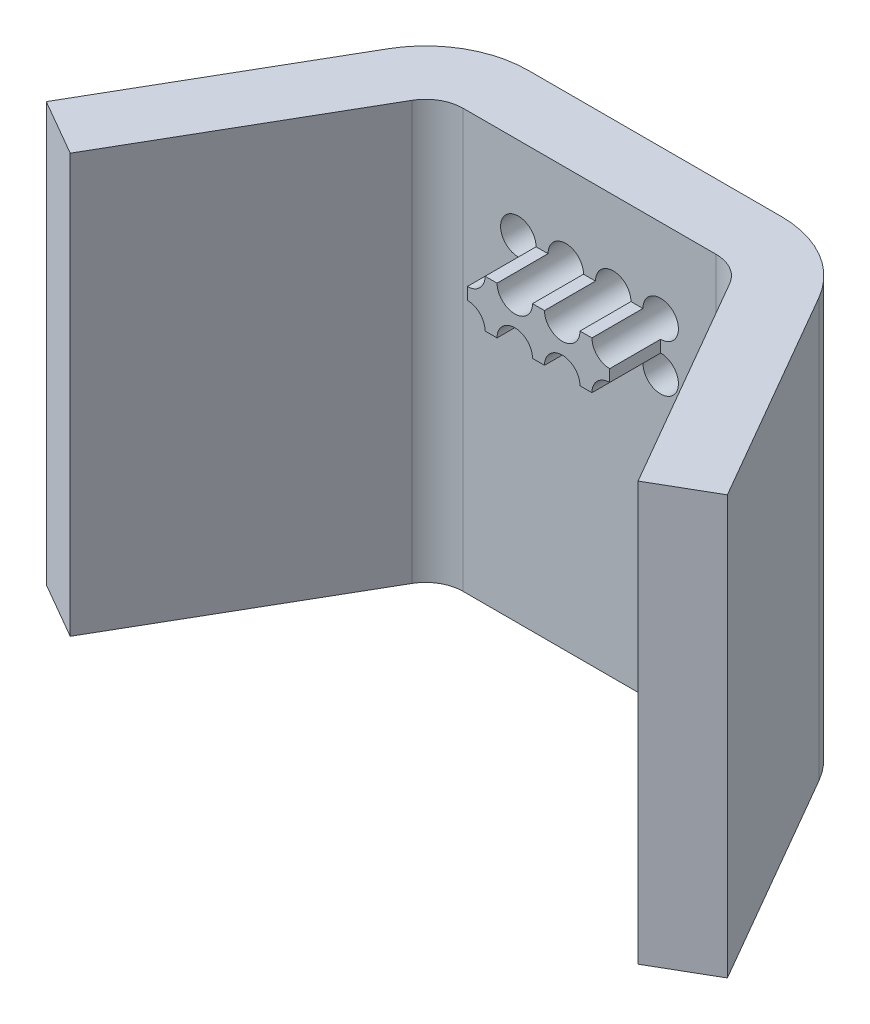
ISO-10303-21;
HEADER;
FILE_DESCRIPTION(('STEP AP214'),'2;1');
FILE_NAME('part.step','',(''),(''),'','','');
FILE_SCHEMA(('AUTOMOTIVE_DESIGN { 1 0 10303 214 1 1 1 1 }'));
ENDSEC;
DATA;
#1=APPLICATION_CONTEXT('core data for automotive mechanical design processes');
#2=APPLICATION_PROTOCOL_DEFINITION('international standard','automotive_design',2000,#1);
#3=PRODUCT_CONTEXT('',#1,'mechanical');
#4=PRODUCT('Part','Part','',(#3));
#5=PRODUCT_RELATED_PRODUCT_CATEGORY('part','',(#4));
#6=PRODUCT_DEFINITION_FORMATION('','',#4);
#7=PRODUCT_DEFINITION_CONTEXT('part definition',#1,'design');
#8=PRODUCT_DEFINITION('design','',#6,#7);
#9=PRODUCT_DEFINITION_SHAPE('','',#8);
#10=(LENGTH_UNIT() NAMED_UNIT(*) SI_UNIT(.MILLI.,.METRE.));
#11=(NAMED_UNIT(*) PLANE_ANGLE_UNIT() SI_UNIT($,.RADIAN.));
#12=(NAMED_UNIT(*) SI_UNIT($,.STERADIAN.) SOLID_ANGLE_UNIT());
#13=UNCERTAINTY_MEASURE_WITH_UNIT(LENGTH_MEASURE(1.E-05),#10,'distance_accuracy_value','');
#14=(GEOMETRIC_REPRESENTATION_CONTEXT(3) GLOBAL_UNCERTAINTY_ASSIGNED_CONTEXT((#13)) GLOBAL_UNIT_ASSIGNED_CONTEXT((#10,
#11,#12)) REPRESENTATION_CONTEXT('',''));
#15=CARTESIAN_POINT('',(0.,0.,0.));
#16=DIRECTION('',(0.,0.,1.));
#17=DIRECTION('',(1.,0.,0.));
#18=AXIS2_PLACEMENT_3D('',#15,#16,#17);
#19=CARTESIAN_POINT('',(-7.92538660821063,22.4,-7.92538660821063));
#20=DIRECTION('',(0.,0.,-1.));
#21=DIRECTION('',(-1.,0.,0.));
#22=AXIS2_PLACEMENT_3D('',#19,#20,#21);
#23=PLANE('',#22);
#24=DIRECTION('',(1.,0.,0.));
#25=VECTOR('',#24,1.);
#26=CARTESIAN_POINT('',(-7.92538660821063,0.,-7.92538660821063));
#27=LINE('',#26,#25);
#28=CARTESIAN_POINT('',(-6.77068606983139,0.,-7.92538660821063));
#29=VERTEX_POINT('',#28);
#30=CARTESIAN_POINT('',(6.77068606983138,0.,-7.92538660821063));
#31=VERTEX_POINT('',#30);
#32=EDGE_CURVE('E265',#29,#31,#27,.T.);
#33=ORIENTED_EDGE('',*,*,#32,.T.);
#34=DIRECTION('',(0.,-1.,0.));
#35=VECTOR('',#34,1.);
#36=CARTESIAN_POINT('',(6.77068606983138,22.4,-7.92538660821063));
#37=LINE('',#36,#35);
#38=CARTESIAN_POINT('',(6.77068606983138,22.4,-7.92538660821063));
#39=VERTEX_POINT('',#38);
#40=EDGE_CURVE('E337',#31,#39,#37,.F.);
#41=ORIENTED_EDGE('',*,*,#40,.T.);
#42=DIRECTION('',(1.,0.,0.));
#43=VECTOR('',#42,1.);
#44=CARTESIAN_POINT('',(-7.92538660821063,22.4,-7.92538660821063));
#45=LINE('',#44,#43);
#46=CARTESIAN_POINT('',(-6.77068606983139,22.4,-7.92538660821063));
#47=VERTEX_POINT('',#46);
#48=EDGE_CURVE('E286',#47,#39,#45,.T.);
#49=ORIENTED_EDGE('',*,*,#48,.F.);
#50=DIRECTION('',(0.,-1.,0.));
#51=VECTOR('',#50,1.);
#52=CARTESIAN_POINT('',(-6.77068606983139,0.,-7.92538660821063));
#53=LINE('',#52,#51);
#54=EDGE_CURVE('E333',#47,#29,#53,.T.);
#55=ORIENTED_EDGE('',*,*,#54,.T.);
#56=EDGE_LOOP('',(#33,#41,#49,#55));
#57=FACE_BOUND('',#56,.T.);
#58=DIRECTION('',(-1.,0.,0.));
#59=VECTOR('',#58,1.);
#60=CARTESIAN_POINT('',(-2.86,17.93,-7.92538660821063));
#61=LINE('',#60,#59);
#62=CARTESIAN_POINT('',(-2.22,17.93,-7.92538660821063));
#63=VERTEX_POINT('',#62);
#64=CARTESIAN_POINT('',(-2.86,17.93,-7.92538660821063));
#65=VERTEX_POINT('',#64);
#66=EDGE_CURVE('E720',#63,#65,#61,.T.);
#67=ORIENTED_EDGE('',*,*,#66,.F.);
#68=CARTESIAN_POINT('',(-1.27,17.93,-7.92538660821063));
#69=DIRECTION('',(0.,0.,-1.));
#70=DIRECTION('',(-1.,0.,0.));
#71=AXIS2_PLACEMENT_3D('',#68,#69,#70);
#72=CIRCLE('',#71,0.949999999999998);
#73=CARTESIAN_POINT('',(-0.320000000000001,17.93,-7.92538660821063));
#74=VERTEX_POINT('',#73);
#75=EDGE_CURVE('E244',#63,#74,#72,.T.);
#76=ORIENTED_EDGE('',*,*,#75,.T.);
#77=DIRECTION('',(-1.,0.,0.));
#78=VECTOR('',#77,1.);
#79=CARTESIAN_POINT('',(-0.32,17.93,-7.92538660821063));
#80=LINE('',#79,#78);
#81=CARTESIAN_POINT('',(0.320000000000003,17.93,-7.92538660821063));
#82=VERTEX_POINT('',#81);
#83=EDGE_CURVE('E726',#82,#74,#80,.T.);
#84=ORIENTED_EDGE('',*,*,#83,.F.);
#85=CARTESIAN_POINT('',(1.27,17.93,-7.92538660821063));
#86=DIRECTION('',(0.,0.,-1.));
#87=DIRECTION('',(-1.,0.,0.));
#88=AXIS2_PLACEMENT_3D('',#85,#86,#87);
#89=CIRCLE('',#88,0.949999999999999);
#90=CARTESIAN_POINT('',(2.22,17.93,-7.92538660821063));
#91=VERTEX_POINT('',#90);
#92=EDGE_CURVE('E819',#82,#91,#89,.T.);
#93=ORIENTED_EDGE('',*,*,#92,.T.);
#94=DIRECTION('',(-1.,0.,0.));
#95=VECTOR('',#94,1.);
#96=CARTESIAN_POINT('',(2.22,17.93,-7.92538660821063));
#97=LINE('',#96,#95);
#98=CARTESIAN_POINT('',(2.86,17.93,-7.92538660821063));
#99=VERTEX_POINT('',#98);
#100=EDGE_CURVE('E732',#99,#91,#97,.T.);
#101=ORIENTED_EDGE('',*,*,#100,.F.);
#102=CARTESIAN_POINT('',(3.81,17.93,-7.92538660821063));
#103=DIRECTION('',(0.,0.,-1.));
#104=DIRECTION('',(-1.,0.,0.));
#105=AXIS2_PLACEMENT_3D('',#102,#103,#104);
#106=CIRCLE('',#105,0.95);
#107=CARTESIAN_POINT('',(3.81,16.98,-7.92538660821063));
#108=VERTEX_POINT('',#107);
#109=EDGE_CURVE('E843',#99,#108,#106,.T.);
#110=ORIENTED_EDGE('',*,*,#109,.T.);
#111=DIRECTION('',(0.,1.,0.));
#112=VECTOR('',#111,1.);
#113=CARTESIAN_POINT('',(3.81,16.98,-7.92538660821063));
#114=LINE('',#113,#112);
#115=CARTESIAN_POINT('',(3.81,16.34,-7.92538660821063));
#116=VERTEX_POINT('',#115);
#117=EDGE_CURVE('E807',#116,#108,#114,.T.);
#118=ORIENTED_EDGE('',*,*,#117,.F.);
#119=CARTESIAN_POINT('',(3.81,15.39,-7.92538660821063));
#120=DIRECTION('',(0.,0.,-1.));
#121=DIRECTION('',(-1.,0.,0.));
#122=AXIS2_PLACEMENT_3D('',#119,#120,#121);
#123=CIRCLE('',#122,0.95);
#124=CARTESIAN_POINT('',(2.86,15.39,-7.92538660821063));
#125=VERTEX_POINT('',#124);
#126=EDGE_CURVE('E877',#116,#125,#123,.T.);
#127=ORIENTED_EDGE('',*,*,#126,.T.);
#128=DIRECTION('',(1.,0.,0.));
#129=VECTOR('',#128,1.);
#130=CARTESIAN_POINT('',(2.22,15.39,-7.92538660821063));
#131=LINE('',#130,#129);
#132=CARTESIAN_POINT('',(2.22,15.39,-7.92538660821063));
#133=VERTEX_POINT('',#132);
#134=EDGE_CURVE('E800',#133,#125,#131,.T.);
#135=ORIENTED_EDGE('',*,*,#134,.F.);
#136=CARTESIAN_POINT('',(1.27,15.39,-7.92538660821063));
#137=DIRECTION('',(0.,0.,-1.));
#138=DIRECTION('',(-1.,0.,0.));
#139=AXIS2_PLACEMENT_3D('',#136,#137,#138);
#140=CIRCLE('',#139,0.949999999999999);
#141=CARTESIAN_POINT('',(0.320000000000002,15.39,-7.92538660821063));
#142=VERTEX_POINT('',#141);
#143=EDGE_CURVE('E879',#133,#142,#140,.T.);
#144=ORIENTED_EDGE('',*,*,#143,.T.);
#145=DIRECTION('',(1.,0.,0.));
#146=VECTOR('',#145,1.);
#147=CARTESIAN_POINT('',(-0.319999999999999,15.39,-7.92538660821063));
#148=LINE('',#147,#146);
#149=CARTESIAN_POINT('',(-0.32,15.39,-7.92538660821063));
#150=VERTEX_POINT('',#149);
#151=EDGE_CURVE('E796',#150,#142,#148,.T.);
#152=ORIENTED_EDGE('',*,*,#151,.F.);
#153=CARTESIAN_POINT('',(-1.27,15.39,-7.92538660821063));
#154=DIRECTION('',(0.,0.,-1.));
#155=DIRECTION('',(-1.,0.,0.));
#156=AXIS2_PLACEMENT_3D('',#153,#154,#155);
#157=CIRCLE('',#156,0.949999999999999);
#158=CARTESIAN_POINT('',(-2.22,15.39,-7.92538660821063));
#159=VERTEX_POINT('',#158);
#160=EDGE_CURVE('E61',#150,#159,#157,.T.);
#161=ORIENTED_EDGE('',*,*,#160,.T.);
#162=DIRECTION('',(1.,0.,0.));
#163=VECTOR('',#162,1.);
#164=CARTESIAN_POINT('',(-2.86,15.39,-7.92538660821063));
#165=LINE('',#164,#163);
#166=CARTESIAN_POINT('',(-2.86,15.39,-7.92538660821063));
#167=VERTEX_POINT('',#166);
#168=EDGE_CURVE('E243',#167,#159,#165,.T.);
#169=ORIENTED_EDGE('',*,*,#168,.F.);
#170=CARTESIAN_POINT('',(-3.81,15.39,-7.92538660821063));
#171=DIRECTION('',(0.,0.,-1.));
#172=DIRECTION('',(-1.,0.,0.));
#173=AXIS2_PLACEMENT_3D('',#170,#171,#172);
#174=CIRCLE('',#173,0.949999999999999);
#175=CARTESIAN_POINT('',(-3.81,16.34,-7.92538660821063));
#176=VERTEX_POINT('',#175);
#177=EDGE_CURVE('E55',#167,#176,#174,.T.);
#178=ORIENTED_EDGE('',*,*,#177,.T.);
#179=DIRECTION('',(0.,-1.,0.));
#180=VECTOR('',#179,1.);
#181=CARTESIAN_POINT('',(-3.81,16.98,-7.92538660821063));
#182=LINE('',#181,#180);
#183=CARTESIAN_POINT('',(-3.81,16.98,-7.92538660821063));
#184=VERTEX_POINT('',#183);
#185=EDGE_CURVE('E238',#184,#176,#182,.T.);
#186=ORIENTED_EDGE('',*,*,#185,.F.);
#187=CARTESIAN_POINT('',(-3.81,17.93,-7.92538660821063));
#188=DIRECTION('',(0.,0.,-1.));
#189=DIRECTION('',(-1.,0.,0.));
#190=AXIS2_PLACEMENT_3D('',#187,#188,#189);
#191=CIRCLE('',#190,0.95);
#192=EDGE_CURVE('E225',#184,#65,#191,.T.);
#193=ORIENTED_EDGE('',*,*,#192,.T.);
#194=EDGE_LOOP('',(#67,#76,#84,#93,#101,#110,#118,#127,#135,#144,#152,#161,#169,#178,#186,#193));
#195=FACE_BOUND('',#194,.T.);
#196=ADVANCED_FACE('F39',(#57,#195),#23,.F.);
#197=CARTESIAN_POINT('',(7.92538660821063,22.4,-7.92538660821063));
#198=DIRECTION('',(0.866025403784436,0.,-0.500000000000004));
#199=DIRECTION('',(-0.500000000000004,0.,-0.866025403784436));
#200=AXIS2_PLACEMENT_3D('',#197,#198,#199);
#201=PLANE('',#200);
#202=DIRECTION('',(0.500000000000004,0.,0.866025403784436));
#203=VECTOR('',#202,1.);
#204=CARTESIAN_POINT('',(7.92538660821063,22.4,-7.92538660821063));
#205=LINE('',#204,#203);
#206=CARTESIAN_POINT('',(8.50273687740026,22.4,-6.92538660821064));
#207=VERTEX_POINT('',#206);
#208=CARTESIAN_POINT('',(15.2,22.4,4.67461339178937));
#209=VERTEX_POINT('',#208);
#210=EDGE_CURVE('E261',#207,#209,#205,.T.);
#211=ORIENTED_EDGE('',*,*,#210,.F.);
#212=DIRECTION('',(0.,-1.,0.));
#213=VECTOR('',#212,1.);
#214=CARTESIAN_POINT('',(8.50273687740026,0.,-6.92538660821064));
#215=LINE('',#214,#213);
#216=CARTESIAN_POINT('',(8.50273687740026,0.,-6.92538660821064));
#217=VERTEX_POINT('',#216);
#218=EDGE_CURVE('E329',#207,#217,#215,.T.);
#219=ORIENTED_EDGE('',*,*,#218,.T.);
#220=DIRECTION('',(0.500000000000004,0.,0.866025403784436));
#221=VECTOR('',#220,1.);
#222=CARTESIAN_POINT('',(7.92538660821063,0.,-7.92538660821063));
#223=LINE('',#222,#221);
#224=CARTESIAN_POINT('',(15.2,0.,4.67461339178937));
#225=VERTEX_POINT('',#224);
#226=EDGE_CURVE('E250',#217,#225,#223,.T.);
#227=ORIENTED_EDGE('',*,*,#226,.T.);
#228=DIRECTION('',(0.,-1.,0.));
#229=VECTOR('',#228,1.);
#230=CARTESIAN_POINT('',(15.2,22.4,4.67461339178937));
#231=LINE('',#230,#229);
#232=EDGE_CURVE('E325',#209,#225,#231,.T.);
#233=ORIENTED_EDGE('',*,*,#232,.F.);
#234=EDGE_LOOP('',(#211,#219,#227,#233));
#235=FACE_BOUND('',#234,.T.);
#236=ADVANCED_FACE('F403',(#235),#201,.F.);
#237=CARTESIAN_POINT('',(15.2,22.4,4.67461339178937));
#238=DIRECTION('',(-0.500000000000004,0.,-0.866025403784436));
#239=DIRECTION('',(-0.866025403784436,0.,0.500000000000004));
#240=AXIS2_PLACEMENT_3D('',#237,#238,#239);
#241=PLANE('',#240);
#242=DIRECTION('',(0.866025403784436,0.,-0.500000000000004));
#243=VECTOR('',#242,1.);
#244=CARTESIAN_POINT('',(15.2,0.,4.67461339178937));
#245=LINE('',#244,#243);
#246=CARTESIAN_POINT('',(18.2310889132455,0.,2.92461339178936));
#247=VERTEX_POINT('',#246);
#248=EDGE_CURVE('E255',#225,#247,#245,.T.);
#249=ORIENTED_EDGE('',*,*,#248,.T.);
#250=DIRECTION('',(0.,-1.,0.));
#251=VECTOR('',#250,1.);
#252=CARTESIAN_POINT('',(18.2310889132455,22.4,2.92461339178936));
#253=LINE('',#252,#251);
#254=CARTESIAN_POINT('',(18.2310889132455,22.4,2.92461339178936));
#255=VERTEX_POINT('',#254);
#256=EDGE_CURVE('E321',#255,#247,#253,.T.);
#257=ORIENTED_EDGE('',*,*,#256,.F.);
#258=DIRECTION('',(0.866025403784436,0.,-0.500000000000004));
#259=VECTOR('',#258,1.);
#260=CARTESIAN_POINT('',(15.2,22.4,4.67461339178937));
#261=LINE('',#260,#259);
#262=EDGE_CURVE('E264',#209,#255,#261,.T.);
#263=ORIENTED_EDGE('',*,*,#262,.F.);
#264=ORIENTED_EDGE('',*,*,#232,.T.);
#265=EDGE_LOOP('',(#249,#257,#263,#264));
#266=FACE_BOUND('',#265,.T.);
#267=ADVANCED_FACE('F397',(#266),#241,.F.);
#268=CARTESIAN_POINT('',(18.2310889132455,22.4,2.92461339178936));
#269=DIRECTION('',(-0.866025403784436,0.,0.500000000000004));
#270=DIRECTION('',(0.500000000000004,0.,0.866025403784436));
#271=AXIS2_PLACEMENT_3D('',#268,#269,#270);
#272=PLANE('',#271);
#273=DIRECTION('',(-0.500000000000004,0.,-0.866025403784436));
#274=VECTOR('',#273,1.);
#275=CARTESIAN_POINT('',(18.2310889132455,0.,2.92461339178936));
#276=LINE('',#275,#274);
#277=CARTESIAN_POINT('',(11.5338257906458,0.,-8.67538660821065));
#278=VERTEX_POINT('',#277);
#279=EDGE_CURVE('E293',#247,#278,#276,.T.);
#280=ORIENTED_EDGE('',*,*,#279,.T.);
#281=DIRECTION('',(0.,-1.,0.));
#282=VECTOR('',#281,1.);
#283=CARTESIAN_POINT('',(11.5338257906458,22.4,-8.67538660821065));
#284=LINE('',#283,#282);
#285=CARTESIAN_POINT('',(11.5338257906458,22.4,-8.67538660821065));
#286=VERTEX_POINT('',#285);
#287=EDGE_CURVE('E368',#278,#286,#284,.F.);
#288=ORIENTED_EDGE('',*,*,#287,.T.);
#289=DIRECTION('',(-0.500000000000004,0.,-0.866025403784436));
#290=VECTOR('',#289,1.);
#291=CARTESIAN_POINT('',(18.2310889132455,22.4,2.92461339178936));
#292=LINE('',#291,#290);
#293=EDGE_CURVE('E268',#255,#286,#292,.T.);
#294=ORIENTED_EDGE('',*,*,#293,.F.);
#295=ORIENTED_EDGE('',*,*,#256,.T.);
#296=EDGE_LOOP('',(#280,#288,#294,#295));
#297=FACE_BOUND('',#296,.T.);
#298=ADVANCED_FACE('F393',(#297),#272,.F.);
#299=CARTESIAN_POINT('',(-9.94611255037431,22.4,-11.4253866082106));
#300=DIRECTION('',(0.,0.,1.));
#301=DIRECTION('',(1.,0.,0.));
#302=AXIS2_PLACEMENT_3D('',#299,#300,#301);
#303=PLANE('',#302);
#304=CARTESIAN_POINT('',(-1.27,17.93,-11.4253866082106));
#305=DIRECTION('',(0.,0.,1.));
#306=DIRECTION('',(1.,0.,0.));
#307=AXIS2_PLACEMENT_3D('',#304,#305,#306);
#308=CIRCLE('',#307,0.949999999999998);
#309=CARTESIAN_POINT('',(-0.32,17.93,-11.4253866082106));
#310=VERTEX_POINT('',#309);
#311=EDGE_CURVE('E889',#310,#310,#308,.T.);
#312=ORIENTED_EDGE('',*,*,#311,.T.);
#313=EDGE_LOOP('',(#312));
#314=FACE_BOUND('',#313,.T.);
#315=CARTESIAN_POINT('',(1.27,17.93,-11.4253866082106));
#316=DIRECTION('',(0.,0.,1.));
#317=DIRECTION('',(1.,0.,0.));
#318=AXIS2_PLACEMENT_3D('',#315,#316,#317);
#319=CIRCLE('',#318,0.949999999999999);
#320=CARTESIAN_POINT('',(2.22,17.93,-11.4253866082106));
#321=VERTEX_POINT('',#320);
#322=EDGE_CURVE('E899',#321,#321,#319,.T.);
#323=ORIENTED_EDGE('',*,*,#322,.T.);
#324=EDGE_LOOP('',(#323));
#325=FACE_BOUND('',#324,.T.);
#326=CARTESIAN_POINT('',(3.81,17.93,-11.4253866082106));
#327=DIRECTION('',(0.,0.,1.));
#328=DIRECTION('',(1.,0.,0.));
#329=AXIS2_PLACEMENT_3D('',#326,#327,#328);
#330=CIRCLE('',#329,0.95);
#331=CARTESIAN_POINT('',(4.76,17.93,-11.4253866082106));
#332=VERTEX_POINT('',#331);
#333=EDGE_CURVE('E894',#332,#332,#330,.T.);
#334=ORIENTED_EDGE('',*,*,#333,.T.);
#335=EDGE_LOOP('',(#334));
#336=FACE_BOUND('',#335,.T.);
#337=CARTESIAN_POINT('',(3.81,15.39,-11.4253866082106));
#338=DIRECTION('',(0.,0.,1.));
#339=DIRECTION('',(1.,0.,0.));
#340=AXIS2_PLACEMENT_3D('',#337,#338,#339);
#341=CIRCLE('',#340,0.95);
#342=CARTESIAN_POINT('',(4.76,15.39,-11.4253866082106));
#343=VERTEX_POINT('',#342);
#344=EDGE_CURVE('E890',#343,#343,#341,.T.);
#345=ORIENTED_EDGE('',*,*,#344,.T.);
#346=EDGE_LOOP('',(#345));
#347=FACE_BOUND('',#346,.T.);
#348=CARTESIAN_POINT('',(1.27,15.39,-11.4253866082106));
#349=DIRECTION('',(0.,0.,1.));
#350=DIRECTION('',(1.,0.,0.));
#351=AXIS2_PLACEMENT_3D('',#348,#349,#350);
#352=CIRCLE('',#351,0.949999999999999);
#353=CARTESIAN_POINT('',(2.22,15.39,-11.4253866082106));
#354=VERTEX_POINT('',#353);
#355=EDGE_CURVE('E895',#354,#354,#352,.T.);
#356=ORIENTED_EDGE('',*,*,#355,.T.);
#357=EDGE_LOOP('',(#356));
#358=FACE_BOUND('',#357,.T.);
#359=CARTESIAN_POINT('',(-1.27,15.39,-11.4253866082106));
#360=DIRECTION('',(0.,0.,1.));
#361=DIRECTION('',(1.,0.,0.));
#362=AXIS2_PLACEMENT_3D('',#359,#360,#361);
#363=CIRCLE('',#362,0.949999999999999);
#364=CARTESIAN_POINT('',(-0.32,15.39,-11.4253866082106));
#365=VERTEX_POINT('',#364);
#366=EDGE_CURVE('E910',#365,#365,#363,.T.);
#367=ORIENTED_EDGE('',*,*,#366,.T.);
#368=EDGE_LOOP('',(#367));
#369=FACE_BOUND('',#368,.T.);
#370=CARTESIAN_POINT('',(-3.81,15.39,-11.4253866082106));
#371=DIRECTION('',(0.,0.,1.));
#372=DIRECTION('',(1.,0.,0.));
#373=AXIS2_PLACEMENT_3D('',#370,#371,#372);
#374=CIRCLE('',#373,0.949999999999999);
#375=CARTESIAN_POINT('',(-2.86,15.39,-11.4253866082106));
#376=VERTEX_POINT('',#375);
#377=EDGE_CURVE('E906',#376,#376,#374,.T.);
#378=ORIENTED_EDGE('',*,*,#377,.T.);
#379=EDGE_LOOP('',(#378));
#380=FACE_BOUND('',#379,.T.);
#381=CARTESIAN_POINT('',(-3.81,17.93,-11.4253866082106));
#382=DIRECTION('',(0.,0.,1.));
#383=DIRECTION('',(1.,0.,0.));
#384=AXIS2_PLACEMENT_3D('',#381,#382,#383);
#385=CIRCLE('',#384,0.95);
#386=CARTESIAN_POINT('',(-2.86,17.93,-11.4253866082106));
#387=VERTEX_POINT('',#386);
#388=EDGE_CURVE('E236',#387,#387,#385,.T.);
#389=ORIENTED_EDGE('',*,*,#388,.T.);
#390=EDGE_LOOP('',(#389));
#391=FACE_BOUND('',#390,.T.);
#392=DIRECTION('',(-1.,0.,0.));
#393=VECTOR('',#392,1.);
#394=CARTESIAN_POINT('',(-9.94611255037431,22.4,-11.4253866082106));
#395=LINE('',#394,#393);
#396=CARTESIAN_POINT('',(6.77068606983139,22.4,-11.4253866082106));
#397=VERTEX_POINT('',#396);
#398=CARTESIAN_POINT('',(-6.77068606983139,22.4,-11.4253866082106));
#399=VERTEX_POINT('',#398);
#400=EDGE_CURVE('E272',#397,#399,#395,.T.);
#401=ORIENTED_EDGE('',*,*,#400,.F.);
#402=DIRECTION('',(0.,-1.,0.));
#403=VECTOR('',#402,1.);
#404=CARTESIAN_POINT('',(6.77068606983139,22.4,-11.4253866082106));
#405=LINE('',#404,#403);
#406=CARTESIAN_POINT('',(6.77068606983139,0.,-11.4253866082106));
#407=VERTEX_POINT('',#406);
#408=EDGE_CURVE('E358',#397,#407,#405,.T.);
#409=ORIENTED_EDGE('',*,*,#408,.T.);
#410=DIRECTION('',(-1.,0.,0.));
#411=VECTOR('',#410,1.);
#412=CARTESIAN_POINT('',(-9.94611255037431,0.,-11.4253866082106));
#413=LINE('',#412,#411);
#414=CARTESIAN_POINT('',(-6.77068606983139,0.,-11.4253866082106));
#415=VERTEX_POINT('',#414);
#416=EDGE_CURVE('E297',#407,#415,#413,.T.);
#417=ORIENTED_EDGE('',*,*,#416,.T.);
#418=DIRECTION('',(0.,-1.,0.));
#419=VECTOR('',#418,1.);
#420=CARTESIAN_POINT('',(-6.77068606983139,22.4,-11.4253866082106));
#421=LINE('',#420,#419);
#422=EDGE_CURVE('E355',#415,#399,#421,.F.);
#423=ORIENTED_EDGE('',*,*,#422,.T.);
#424=EDGE_LOOP('',(#401,#409,#417,#423));
#425=FACE_BOUND('',#424,.T.);
#426=ADVANCED_FACE('F384',(#314,#325,#336,#347,#358,#369,#380,#391,#425),#303,.F.);
#427=CARTESIAN_POINT('',(-18.2310889132455,22.4,2.92461339178936));
#428=DIRECTION('',(0.866025403784436,0.,0.500000000000004));
#429=DIRECTION('',(0.500000000000004,0.,-0.866025403784436));
#430=AXIS2_PLACEMENT_3D('',#427,#428,#429);
#431=PLANE('',#430);
#432=DIRECTION('',(-0.500000000000004,0.,0.866025403784436));
#433=VECTOR('',#432,1.);
#434=CARTESIAN_POINT('',(-18.2310889132455,22.4,2.92461339178936));
#435=LINE('',#434,#433);
#436=CARTESIAN_POINT('',(-11.5338257906458,22.4,-8.67538660821065));
#437=VERTEX_POINT('',#436);
#438=CARTESIAN_POINT('',(-18.2310889132455,22.4,2.92461339178936));
#439=VERTEX_POINT('',#438);
#440=EDGE_CURVE('E276',#437,#439,#435,.T.);
#441=ORIENTED_EDGE('',*,*,#440,.F.);
#442=DIRECTION('',(0.,-1.,0.));
#443=VECTOR('',#442,1.);
#444=CARTESIAN_POINT('',(-11.5338257906458,22.4,-8.67538660821065));
#445=LINE('',#444,#443);
#446=CARTESIAN_POINT('',(-11.5338257906458,0.,-8.67538660821065));
#447=VERTEX_POINT('',#446);
#448=EDGE_CURVE('E11',#437,#447,#445,.T.);
#449=ORIENTED_EDGE('',*,*,#448,.T.);
#450=DIRECTION('',(-0.500000000000004,0.,0.866025403784436));
#451=VECTOR('',#450,1.);
#452=CARTESIAN_POINT('',(-18.2310889132455,0.,2.92461339178936));
#453=LINE('',#452,#451);
#454=CARTESIAN_POINT('',(-18.2310889132455,0.,2.92461339178936));
#455=VERTEX_POINT('',#454);
#456=EDGE_CURVE('E301',#447,#455,#453,.T.);
#457=ORIENTED_EDGE('',*,*,#456,.T.);
#458=DIRECTION('',(0.,-1.,0.));
#459=VECTOR('',#458,1.);
#460=CARTESIAN_POINT('',(-18.2310889132455,22.4,2.92461339178936));
#461=LINE('',#460,#459);
#462=EDGE_CURVE('E317',#439,#455,#461,.T.);
#463=ORIENTED_EDGE('',*,*,#462,.F.);
#464=EDGE_LOOP('',(#441,#449,#457,#463));
#465=FACE_BOUND('',#464,.T.);
#466=ADVANCED_FACE('F429',(#465),#431,.F.);
#467=CARTESIAN_POINT('',(-15.2,22.4,4.67461339178937));
#468=DIRECTION('',(0.500000000000004,0.,-0.866025403784436));
#469=DIRECTION('',(-0.866025403784436,0.,-0.500000000000004));
#470=AXIS2_PLACEMENT_3D('',#467,#468,#469);
#471=PLANE('',#470);
#472=DIRECTION('',(0.866025403784436,0.,0.500000000000004));
#473=VECTOR('',#472,1.);
#474=CARTESIAN_POINT('',(-15.2,0.,4.67461339178937));
#475=LINE('',#474,#473);
#476=CARTESIAN_POINT('',(-15.2,0.,4.67461339178937));
#477=VERTEX_POINT('',#476);
#478=EDGE_CURVE('E304',#455,#477,#475,.T.);
#479=ORIENTED_EDGE('',*,*,#478,.T.);
#480=DIRECTION('',(0.,-1.,0.));
#481=VECTOR('',#480,1.);
#482=CARTESIAN_POINT('',(-15.2,22.4,4.67461339178937));
#483=LINE('',#482,#481);
#484=CARTESIAN_POINT('',(-15.2,22.4,4.67461339178937));
#485=VERTEX_POINT('',#484);
#486=EDGE_CURVE('E289',#485,#477,#483,.T.);
#487=ORIENTED_EDGE('',*,*,#486,.F.);
#488=DIRECTION('',(0.866025403784436,0.,0.500000000000004));
#489=VECTOR('',#488,1.);
#490=CARTESIAN_POINT('',(-15.2,22.4,4.67461339178937));
#491=LINE('',#490,#489);
#492=EDGE_CURVE('E279',#439,#485,#491,.T.);
#493=ORIENTED_EDGE('',*,*,#492,.F.);
#494=ORIENTED_EDGE('',*,*,#462,.T.);
#495=EDGE_LOOP('',(#479,#487,#493,#494));
#496=FACE_BOUND('',#495,.T.);
#497=ADVANCED_FACE('F424',(#496),#471,.F.);
#498=CARTESIAN_POINT('',(-7.92538660821063,22.4,-7.92538660821063));
#499=DIRECTION('',(-0.866025403784436,0.,-0.500000000000004));
#500=DIRECTION('',(-0.500000000000004,0.,0.866025403784436));
#501=AXIS2_PLACEMENT_3D('',#498,#499,#500);
#502=PLANE('',#501);
#503=DIRECTION('',(0.500000000000004,0.,-0.866025403784436));
#504=VECTOR('',#503,1.);
#505=CARTESIAN_POINT('',(-7.92538660821063,0.,-7.92538660821063));
#506=LINE('',#505,#504);
#507=CARTESIAN_POINT('',(-8.50273687740026,0.,-6.92538660821063));
#508=VERTEX_POINT('',#507);
#509=EDGE_CURVE('E307',#477,#508,#506,.T.);
#510=ORIENTED_EDGE('',*,*,#509,.T.);
#511=DIRECTION('',(0.,-1.,0.));
#512=VECTOR('',#511,1.);
#513=CARTESIAN_POINT('',(-8.50273687740026,22.4,-6.92538660821064));
#514=LINE('',#513,#512);
#515=CARTESIAN_POINT('',(-8.50273687740026,22.4,-6.92538660821063));
#516=VERTEX_POINT('',#515);
#517=EDGE_CURVE('E340',#508,#516,#514,.F.);
#518=ORIENTED_EDGE('',*,*,#517,.T.);
#519=DIRECTION('',(0.500000000000004,0.,-0.866025403784436));
#520=VECTOR('',#519,1.);
#521=CARTESIAN_POINT('',(-7.92538660821063,22.4,-7.92538660821063));
#522=LINE('',#521,#520);
#523=EDGE_CURVE('E282',#485,#516,#522,.T.);
#524=ORIENTED_EDGE('',*,*,#523,.F.);
#525=ORIENTED_EDGE('',*,*,#486,.T.);
#526=EDGE_LOOP('',(#510,#518,#524,#525));
#527=FACE_BOUND('',#526,.T.);
#528=ADVANCED_FACE('F420',(#527),#502,.F.);
#529=CARTESIAN_POINT('',(0.,22.4,0.));
#530=DIRECTION('',(0.,1.,0.));
#531=DIRECTION('',(0.,0.,1.));
#532=AXIS2_PLACEMENT_3D('',#529,#530,#531);
#533=PLANE('',#532);
#534=ORIENTED_EDGE('',*,*,#293,.T.);
#535=CARTESIAN_POINT('',(6.77068606983139,22.4,-5.92538660821062));
#536=DIRECTION('',(0.,1.,0.));
#537=DIRECTION('',(0.,0.,1.));
#538=AXIS2_PLACEMENT_3D('',#535,#536,#537);
#539=CIRCLE('',#538,5.5);
#540=EDGE_CURVE('E48',#286,#397,#539,.T.);
#541=ORIENTED_EDGE('',*,*,#540,.T.);
#542=ORIENTED_EDGE('',*,*,#400,.T.);
#543=CARTESIAN_POINT('',(-6.77068606983139,22.4,-5.92538660821062));
#544=DIRECTION('',(0.,1.,0.));
#545=DIRECTION('',(0.,0.,1.));
#546=AXIS2_PLACEMENT_3D('',#543,#544,#545);
#547=CIRCLE('',#546,5.5);
#548=EDGE_CURVE('E371',#399,#437,#547,.T.);
#549=ORIENTED_EDGE('',*,*,#548,.T.);
#550=ORIENTED_EDGE('',*,*,#440,.T.);
#551=ORIENTED_EDGE('',*,*,#492,.T.);
#552=ORIENTED_EDGE('',*,*,#523,.T.);
#553=CARTESIAN_POINT('',(-6.77068606983139,22.4,-5.92538660821063));
#554=DIRECTION('',(0.,1.,0.));
#555=DIRECTION('',(0.,0.,1.));
#556=AXIS2_PLACEMENT_3D('',#553,#554,#555);
#557=CIRCLE('',#556,2.);
#558=EDGE_CURVE('E352',#516,#47,#557,.F.);
#559=ORIENTED_EDGE('',*,*,#558,.T.);
#560=ORIENTED_EDGE('',*,*,#48,.T.);
#561=CARTESIAN_POINT('',(6.77068606983138,22.4,-5.92538660821063));
#562=DIRECTION('',(0.,1.,0.));
#563=DIRECTION('',(0.,0.,1.));
#564=AXIS2_PLACEMENT_3D('',#561,#562,#563);
#565=CIRCLE('',#564,2.);
#566=EDGE_CURVE('E346',#39,#207,#565,.F.);
#567=ORIENTED_EDGE('',*,*,#566,.T.);
#568=ORIENTED_EDGE('',*,*,#210,.T.);
#569=ORIENTED_EDGE('',*,*,#262,.T.);
#570=EDGE_LOOP('',(#534,#541,#542,#549,#550,#551,#552,#559,#560,#567,#568,#569));
#571=FACE_BOUND('',#570,.T.);
#572=ADVANCED_FACE('F377',(#571),#533,.T.);
#573=CARTESIAN_POINT('',(0.,0.,0.));
#574=DIRECTION('',(0.,1.,0.));
#575=DIRECTION('',(0.,0.,1.));
#576=AXIS2_PLACEMENT_3D('',#573,#574,#575);
#577=PLANE('',#576);
#578=ORIENTED_EDGE('',*,*,#416,.F.);
#579=CARTESIAN_POINT('',(6.77068606983139,0.,-5.92538660821062));
#580=DIRECTION('',(0.,1.,0.));
#581=DIRECTION('',(0.,0.,1.));
#582=AXIS2_PLACEMENT_3D('',#579,#580,#581);
#583=CIRCLE('',#582,5.5);
#584=EDGE_CURVE('E365',#407,#278,#583,.F.);
#585=ORIENTED_EDGE('',*,*,#584,.T.);
#586=ORIENTED_EDGE('',*,*,#279,.F.);
#587=ORIENTED_EDGE('',*,*,#248,.F.);
#588=ORIENTED_EDGE('',*,*,#226,.F.);
#589=CARTESIAN_POINT('',(6.77068606983138,0.,-5.92538660821063));
#590=DIRECTION('',(0.,1.,0.));
#591=DIRECTION('',(0.,0.,1.));
#592=AXIS2_PLACEMENT_3D('',#589,#590,#591);
#593=CIRCLE('',#592,2.);
#594=EDGE_CURVE('E343',#217,#31,#593,.T.);
#595=ORIENTED_EDGE('',*,*,#594,.T.);
#596=ORIENTED_EDGE('',*,*,#32,.F.);
#597=CARTESIAN_POINT('',(-6.77068606983139,0.,-5.92538660821063));
#598=DIRECTION('',(0.,1.,0.));
#599=DIRECTION('',(0.,0.,1.));
#600=AXIS2_PLACEMENT_3D('',#597,#598,#599);
#601=CIRCLE('',#600,2.);
#602=EDGE_CURVE('E349',#29,#508,#601,.T.);
#603=ORIENTED_EDGE('',*,*,#602,.T.);
#604=ORIENTED_EDGE('',*,*,#509,.F.);
#605=ORIENTED_EDGE('',*,*,#478,.F.);
#606=ORIENTED_EDGE('',*,*,#456,.F.);
#607=CARTESIAN_POINT('',(-6.77068606983139,0.,-5.92538660821062));
#608=DIRECTION('',(0.,1.,0.));
#609=DIRECTION('',(0.,0.,1.));
#610=AXIS2_PLACEMENT_3D('',#607,#608,#609);
#611=CIRCLE('',#610,5.5);
#612=EDGE_CURVE('E362',#447,#415,#611,.F.);
#613=ORIENTED_EDGE('',*,*,#612,.T.);
#614=EDGE_LOOP('',(#578,#585,#586,#587,#588,#595,#596,#603,#604,#605,#606,#613));
#615=FACE_BOUND('',#614,.T.);
#616=ADVANCED_FACE('F390',(#615),#577,.F.);
#617=CARTESIAN_POINT('',(6.77068606983138,22.4,-5.92538660821063));
#618=DIRECTION('',(0.,1.,0.));
#619=DIRECTION('',(0.,0.,1.));
#620=AXIS2_PLACEMENT_3D('',#617,#618,#619);
#621=CYLINDRICAL_SURFACE('',#620,2.);
#622=ORIENTED_EDGE('',*,*,#566,.F.);
#623=ORIENTED_EDGE('',*,*,#40,.F.);
#624=ORIENTED_EDGE('',*,*,#594,.F.);
#625=ORIENTED_EDGE('',*,*,#218,.F.);
#626=EDGE_LOOP('',(#622,#623,#624,#625));
#627=FACE_BOUND('',#626,.T.);
#628=ADVANCED_FACE('F407',(#627),#621,.F.);
#629=CARTESIAN_POINT('',(-6.77068606983139,22.4,-5.92538660821063));
#630=DIRECTION('',(0.,1.,0.));
#631=DIRECTION('',(0.,0.,1.));
#632=AXIS2_PLACEMENT_3D('',#629,#630,#631);
#633=CYLINDRICAL_SURFACE('',#632,2.);
#634=ORIENTED_EDGE('',*,*,#558,.F.);
#635=ORIENTED_EDGE('',*,*,#517,.F.);
#636=ORIENTED_EDGE('',*,*,#602,.F.);
#637=ORIENTED_EDGE('',*,*,#54,.F.);
#638=EDGE_LOOP('',(#634,#635,#636,#637));
#639=FACE_BOUND('',#638,.T.);
#640=ADVANCED_FACE('F416',(#639),#633,.F.);
#641=CARTESIAN_POINT('',(6.77068606983139,22.4,-5.92538660821062));
#642=DIRECTION('',(0.,-1.,0.));
#643=DIRECTION('',(0.,0.,-1.));
#644=AXIS2_PLACEMENT_3D('',#641,#642,#643);
#645=CYLINDRICAL_SURFACE('',#644,5.5);
#646=ORIENTED_EDGE('',*,*,#540,.F.);
#647=ORIENTED_EDGE('',*,*,#287,.F.);
#648=ORIENTED_EDGE('',*,*,#584,.F.);
#649=ORIENTED_EDGE('',*,*,#408,.F.);
#650=EDGE_LOOP('',(#646,#647,#648,#649));
#651=FACE_BOUND('',#650,.T.);
#652=ADVANCED_FACE('F387',(#651),#645,.T.);
#653=CARTESIAN_POINT('',(-6.77068606983139,22.4,-5.92538660821062));
#654=DIRECTION('',(0.,-1.,0.));
#655=DIRECTION('',(0.,0.,-1.));
#656=AXIS2_PLACEMENT_3D('',#653,#654,#655);
#657=CYLINDRICAL_SURFACE('',#656,5.5);
#658=ORIENTED_EDGE('',*,*,#548,.F.);
#659=ORIENTED_EDGE('',*,*,#422,.F.);
#660=ORIENTED_EDGE('',*,*,#612,.F.);
#661=ORIENTED_EDGE('',*,*,#448,.F.);
#662=EDGE_LOOP('',(#658,#659,#660,#661));
#663=FACE_BOUND('',#662,.T.);
#664=ADVANCED_FACE('F41',(#663),#657,.T.);
#665=CARTESIAN_POINT('',(-3.81,17.93,-5.19538660821063));
#666=DIRECTION('',(0.,0.,-1.));
#667=DIRECTION('',(-1.,0.,0.));
#668=AXIS2_PLACEMENT_3D('',#665,#666,#667);
#669=CYLINDRICAL_SURFACE('',#668,0.95);
#670=DIRECTION('',(0.,0.,-1.));
#671=VECTOR('',#670,1.);
#672=CARTESIAN_POINT('',(-2.86,17.93,-5.19538660821063));
#673=LINE('',#672,#671);
#674=CARTESIAN_POINT('',(-2.86,17.93,-5.19538660821063));
#675=VERTEX_POINT('',#674);
#676=EDGE_CURVE('E232',#675,#65,#673,.T.);
#677=ORIENTED_EDGE('',*,*,#676,.T.);
#678=ORIENTED_EDGE('',*,*,#192,.F.);
#679=DIRECTION('',(0.,0.,-1.));
#680=VECTOR('',#679,1.);
#681=CARTESIAN_POINT('',(-3.81,16.98,-5.19538660821063));
#682=LINE('',#681,#680);
#683=CARTESIAN_POINT('',(-3.81,16.98,-5.19538660821063));
#684=VERTEX_POINT('',#683);
#685=EDGE_CURVE('E230',#684,#184,#682,.T.);
#686=ORIENTED_EDGE('',*,*,#685,.F.);
#687=CARTESIAN_POINT('',(-3.81,17.93,-5.19538660821063));
#688=DIRECTION('',(0.,0.,-1.));
#689=DIRECTION('',(-1.,0.,0.));
#690=AXIS2_PLACEMENT_3D('',#687,#688,#689);
#691=CIRCLE('',#690,0.95);
#692=EDGE_CURVE('E725',#675,#684,#691,.T.);
#693=ORIENTED_EDGE('',*,*,#692,.F.);
#694=EDGE_LOOP('',(#677,#678,#686,#693));
#695=FACE_BOUND('',#694,.T.);
#696=ORIENTED_EDGE('',*,*,#388,.F.);
#697=EDGE_LOOP('',(#696));
#698=FACE_BOUND('',#697,.T.);
#699=ADVANCED_FACE('F226',(#695,#698),#669,.F.);
#700=CARTESIAN_POINT('',(-3.81,16.98,-5.19538660821063));
#701=DIRECTION('',(1.,0.,0.));
#702=DIRECTION('',(0.,0.,-1.));
#703=AXIS2_PLACEMENT_3D('',#700,#701,#702);
#704=PLANE('',#703);
#705=ORIENTED_EDGE('',*,*,#185,.T.);
#706=DIRECTION('',(0.,0.,-1.));
#707=VECTOR('',#706,1.);
#708=CARTESIAN_POINT('',(-3.81,16.34,-5.19538660821063));
#709=LINE('',#708,#707);
#710=CARTESIAN_POINT('',(-3.81,16.34,-5.19538660821063));
#711=VERTEX_POINT('',#710);
#712=EDGE_CURVE('E251',#711,#176,#709,.T.);
#713=ORIENTED_EDGE('',*,*,#712,.F.);
#714=DIRECTION('',(0.,-1.,0.));
#715=VECTOR('',#714,1.);
#716=CARTESIAN_POINT('',(-3.81,16.98,-5.19538660821063));
#717=LINE('',#716,#715);
#718=EDGE_CURVE('E247',#684,#711,#717,.T.);
#719=ORIENTED_EDGE('',*,*,#718,.F.);
#720=ORIENTED_EDGE('',*,*,#685,.T.);
#721=EDGE_LOOP('',(#705,#713,#719,#720));
#722=FACE_BOUND('',#721,.T.);
#723=ADVANCED_FACE('F246',(#722),#704,.F.);
#724=CARTESIAN_POINT('',(-3.81,15.39,-5.19538660821063));
#725=DIRECTION('',(0.,0.,-1.));
#726=DIRECTION('',(-1.,0.,0.));
#727=AXIS2_PLACEMENT_3D('',#724,#725,#726);
#728=CYLINDRICAL_SURFACE('',#727,0.95);
#729=ORIENTED_EDGE('',*,*,#712,.T.);
#730=ORIENTED_EDGE('',*,*,#177,.F.);
#731=DIRECTION('',(0.,0.,-1.));
#732=VECTOR('',#731,1.);
#733=CARTESIAN_POINT('',(-2.86,15.39,-5.19538660821063));
#734=LINE('',#733,#732);
#735=CARTESIAN_POINT('',(-2.86,15.39,-5.19538660821063));
#736=VERTEX_POINT('',#735);
#737=EDGE_CURVE('E257',#736,#167,#734,.T.);
#738=ORIENTED_EDGE('',*,*,#737,.F.);
#739=CARTESIAN_POINT('',(-3.81,15.39,-5.19538660821063));
#740=DIRECTION('',(0.,0.,-1.));
#741=DIRECTION('',(-1.,0.,0.));
#742=AXIS2_PLACEMENT_3D('',#739,#740,#741);
#743=CIRCLE('',#742,0.95);
#744=EDGE_CURVE('E792',#711,#736,#743,.T.);
#745=ORIENTED_EDGE('',*,*,#744,.F.);
#746=EDGE_LOOP('',(#729,#730,#738,#745));
#747=FACE_BOUND('',#746,.T.);
#748=ORIENTED_EDGE('',*,*,#377,.F.);
#749=EDGE_LOOP('',(#748));
#750=FACE_BOUND('',#749,.T.);
#751=ADVANCED_FACE('F523',(#747,#750),#728,.F.);
#752=CARTESIAN_POINT('',(-2.86,15.39,-5.19538660821063));
#753=DIRECTION('',(0.,1.,0.));
#754=DIRECTION('',(0.,0.,1.));
#755=AXIS2_PLACEMENT_3D('',#752,#753,#754);
#756=PLANE('',#755);
#757=ORIENTED_EDGE('',*,*,#168,.T.);
#758=DIRECTION('',(0.,0.,-1.));
#759=VECTOR('',#758,1.);
#760=CARTESIAN_POINT('',(-2.22,15.39,-5.19538660821063));
#761=LINE('',#760,#759);
#762=CARTESIAN_POINT('',(-2.22,15.39,-5.19538660821063));
#763=VERTEX_POINT('',#762);
#764=EDGE_CURVE('E781',#763,#159,#761,.T.);
#765=ORIENTED_EDGE('',*,*,#764,.F.);
#766=DIRECTION('',(1.,0.,0.));
#767=VECTOR('',#766,1.);
#768=CARTESIAN_POINT('',(-2.86,15.39,-5.19538660821063));
#769=LINE('',#768,#767);
#770=EDGE_CURVE('E789',#736,#763,#769,.T.);
#771=ORIENTED_EDGE('',*,*,#770,.F.);
#772=ORIENTED_EDGE('',*,*,#737,.T.);
#773=EDGE_LOOP('',(#757,#765,#771,#772));
#774=FACE_BOUND('',#773,.T.);
#775=ADVANCED_FACE('F532',(#774),#756,.F.);
#776=CARTESIAN_POINT('',(-1.27,15.39,-5.19538660821063));
#777=DIRECTION('',(0.,0.,-1.));
#778=DIRECTION('',(-1.,0.,0.));
#779=AXIS2_PLACEMENT_3D('',#776,#777,#778);
#780=CYLINDRICAL_SURFACE('',#779,0.949999999999999);
#781=ORIENTED_EDGE('',*,*,#764,.T.);
#782=ORIENTED_EDGE('',*,*,#160,.F.);
#783=DIRECTION('',(0.,0.,-1.));
#784=VECTOR('',#783,1.);
#785=CARTESIAN_POINT('',(-0.319999999999999,15.39,-5.19538660821063));
#786=LINE('',#785,#784);
#787=CARTESIAN_POINT('',(-0.319999999999999,15.39,-5.19538660821063));
#788=VERTEX_POINT('',#787);
#789=EDGE_CURVE('E777',#788,#150,#786,.T.);
#790=ORIENTED_EDGE('',*,*,#789,.F.);
#791=CARTESIAN_POINT('',(-1.27,15.39,-5.19538660821063));
#792=DIRECTION('',(0.,0.,-1.));
#793=DIRECTION('',(-1.,0.,0.));
#794=AXIS2_PLACEMENT_3D('',#791,#792,#793);
#795=CIRCLE('',#794,0.949999999999999);
#796=EDGE_CURVE('E853',#763,#788,#795,.T.);
#797=ORIENTED_EDGE('',*,*,#796,.F.);
#798=EDGE_LOOP('',(#781,#782,#790,#797));
#799=FACE_BOUND('',#798,.T.);
#800=ORIENTED_EDGE('',*,*,#366,.F.);
#801=EDGE_LOOP('',(#800));
#802=FACE_BOUND('',#801,.T.);
#803=ADVANCED_FACE('F543',(#799,#802),#780,.F.);
#804=CARTESIAN_POINT('',(-0.319999999999999,15.39,-5.19538660821063));
#805=DIRECTION('',(0.,1.,0.));
#806=DIRECTION('',(0.,0.,1.));
#807=AXIS2_PLACEMENT_3D('',#804,#805,#806);
#808=PLANE('',#807);
#809=ORIENTED_EDGE('',*,*,#151,.T.);
#810=DIRECTION('',(0.,0.,-1.));
#811=VECTOR('',#810,1.);
#812=CARTESIAN_POINT('',(0.320000000000002,15.39,-5.19538660821063));
#813=LINE('',#812,#811);
#814=CARTESIAN_POINT('',(0.320000000000002,15.39,-5.19538660821063));
#815=VERTEX_POINT('',#814);
#816=EDGE_CURVE('E773',#815,#142,#813,.T.);
#817=ORIENTED_EDGE('',*,*,#816,.F.);
#818=DIRECTION('',(1.,0.,0.));
#819=VECTOR('',#818,1.);
#820=CARTESIAN_POINT('',(-0.319999999999999,15.39,-5.19538660821063));
#821=LINE('',#820,#819);
#822=EDGE_CURVE('E856',#788,#815,#821,.T.);
#823=ORIENTED_EDGE('',*,*,#822,.F.);
#824=ORIENTED_EDGE('',*,*,#789,.T.);
#825=EDGE_LOOP('',(#809,#817,#823,#824));
#826=FACE_BOUND('',#825,.T.);
#827=ADVANCED_FACE('F553',(#826),#808,.F.);
#828=CARTESIAN_POINT('',(1.27,15.39,-5.19538660821063));
#829=DIRECTION('',(0.,0.,-1.));
#830=DIRECTION('',(-1.,0.,0.));
#831=AXIS2_PLACEMENT_3D('',#828,#829,#830);
#832=CYLINDRICAL_SURFACE('',#831,0.949999999999999);
#833=ORIENTED_EDGE('',*,*,#816,.T.);
#834=ORIENTED_EDGE('',*,*,#143,.F.);
#835=DIRECTION('',(0.,0.,-1.));
#836=VECTOR('',#835,1.);
#837=CARTESIAN_POINT('',(2.22,15.39,-5.19538660821063));
#838=LINE('',#837,#836);
#839=CARTESIAN_POINT('',(2.22,15.39,-5.19538660821063));
#840=VERTEX_POINT('',#839);
#841=EDGE_CURVE('E769',#840,#133,#838,.T.);
#842=ORIENTED_EDGE('',*,*,#841,.F.);
#843=CARTESIAN_POINT('',(1.27,15.39,-5.19538660821063));
#844=DIRECTION('',(0.,0.,-1.));
#845=DIRECTION('',(-1.,0.,0.));
#846=AXIS2_PLACEMENT_3D('',#843,#844,#845);
#847=CIRCLE('',#846,0.949999999999999);
#848=EDGE_CURVE('E859',#815,#840,#847,.T.);
#849=ORIENTED_EDGE('',*,*,#848,.F.);
#850=EDGE_LOOP('',(#833,#834,#842,#849));
#851=FACE_BOUND('',#850,.T.);
#852=ORIENTED_EDGE('',*,*,#355,.F.);
#853=EDGE_LOOP('',(#852));
#854=FACE_BOUND('',#853,.T.);
#855=ADVANCED_FACE('F564',(#851,#854),#832,.F.);
#856=CARTESIAN_POINT('',(2.22,15.39,-5.19538660821063));
#857=DIRECTION('',(0.,1.,0.));
#858=DIRECTION('',(0.,0.,1.));
#859=AXIS2_PLACEMENT_3D('',#856,#857,#858);
#860=PLANE('',#859);
#861=ORIENTED_EDGE('',*,*,#134,.T.);
#862=DIRECTION('',(0.,0.,-1.));
#863=VECTOR('',#862,1.);
#864=CARTESIAN_POINT('',(2.86,15.39,-5.19538660821063));
#865=LINE('',#864,#863);
#866=CARTESIAN_POINT('',(2.86,15.39,-5.19538660821063));
#867=VERTEX_POINT('',#866);
#868=EDGE_CURVE('E765',#867,#125,#865,.T.);
#869=ORIENTED_EDGE('',*,*,#868,.F.);
#870=DIRECTION('',(1.,0.,0.));
#871=VECTOR('',#870,1.);
#872=CARTESIAN_POINT('',(2.22,15.39,-5.19538660821063));
#873=LINE('',#872,#871);
#874=EDGE_CURVE('E862',#840,#867,#873,.T.);
#875=ORIENTED_EDGE('',*,*,#874,.F.);
#876=ORIENTED_EDGE('',*,*,#841,.T.);
#877=EDGE_LOOP('',(#861,#869,#875,#876));
#878=FACE_BOUND('',#877,.T.);
#879=ADVANCED_FACE('F574',(#878),#860,.F.);
#880=CARTESIAN_POINT('',(3.81,15.39,-5.19538660821063));
#881=DIRECTION('',(0.,0.,-1.));
#882=DIRECTION('',(-1.,0.,0.));
#883=AXIS2_PLACEMENT_3D('',#880,#881,#882);
#884=CYLINDRICAL_SURFACE('',#883,0.95);
#885=ORIENTED_EDGE('',*,*,#868,.T.);
#886=ORIENTED_EDGE('',*,*,#126,.F.);
#887=DIRECTION('',(0.,0.,-1.));
#888=VECTOR('',#887,1.);
#889=CARTESIAN_POINT('',(3.81,16.34,-5.19538660821063));
#890=LINE('',#889,#888);
#891=CARTESIAN_POINT('',(3.81,16.34,-5.19538660821063));
#892=VERTEX_POINT('',#891);
#893=EDGE_CURVE('E761',#892,#116,#890,.T.);
#894=ORIENTED_EDGE('',*,*,#893,.F.);
#895=CARTESIAN_POINT('',(3.81,15.39,-5.19538660821063));
#896=DIRECTION('',(0.,0.,-1.));
#897=DIRECTION('',(1.,0.,0.));
#898=AXIS2_PLACEMENT_3D('',#895,#896,#897);
#899=CIRCLE('',#898,0.95);
#900=EDGE_CURVE('E865',#867,#892,#899,.T.);
#901=ORIENTED_EDGE('',*,*,#900,.F.);
#902=EDGE_LOOP('',(#885,#886,#894,#901));
#903=FACE_BOUND('',#902,.T.);
#904=ORIENTED_EDGE('',*,*,#344,.F.);
#905=EDGE_LOOP('',(#904));
#906=FACE_BOUND('',#905,.T.);
#907=ADVANCED_FACE('F585',(#903,#906),#884,.F.);
#908=CARTESIAN_POINT('',(3.81,16.98,-5.19538660821063));
#909=DIRECTION('',(-1.,0.,0.));
#910=DIRECTION('',(0.,0.,1.));
#911=AXIS2_PLACEMENT_3D('',#908,#909,#910);
#912=PLANE('',#911);
#913=ORIENTED_EDGE('',*,*,#117,.T.);
#914=DIRECTION('',(0.,0.,-1.));
#915=VECTOR('',#914,1.);
#916=CARTESIAN_POINT('',(3.81,16.98,-5.19538660821063));
#917=LINE('',#916,#915);
#918=CARTESIAN_POINT('',(3.81,16.98,-5.19538660821063));
#919=VERTEX_POINT('',#918);
#920=EDGE_CURVE('E757',#919,#108,#917,.T.);
#921=ORIENTED_EDGE('',*,*,#920,.F.);
#922=DIRECTION('',(0.,1.,0.));
#923=VECTOR('',#922,1.);
#924=CARTESIAN_POINT('',(3.81,16.98,-5.19538660821063));
#925=LINE('',#924,#923);
#926=EDGE_CURVE('E868',#892,#919,#925,.T.);
#927=ORIENTED_EDGE('',*,*,#926,.F.);
#928=ORIENTED_EDGE('',*,*,#893,.T.);
#929=EDGE_LOOP('',(#913,#921,#927,#928));
#930=FACE_BOUND('',#929,.T.);
#931=ADVANCED_FACE('F595',(#930),#912,.F.);
#932=CARTESIAN_POINT('',(3.81,17.93,-5.19538660821063));
#933=DIRECTION('',(0.,0.,-1.));
#934=DIRECTION('',(-1.,0.,0.));
#935=AXIS2_PLACEMENT_3D('',#932,#933,#934);
#936=CYLINDRICAL_SURFACE('',#935,0.95);
#937=ORIENTED_EDGE('',*,*,#920,.T.);
#938=ORIENTED_EDGE('',*,*,#109,.F.);
#939=DIRECTION('',(0.,0.,-1.));
#940=VECTOR('',#939,1.);
#941=CARTESIAN_POINT('',(2.86,17.93,-5.19538660821063));
#942=LINE('',#941,#940);
#943=CARTESIAN_POINT('',(2.86,17.93,-5.19538660821063));
#944=VERTEX_POINT('',#943);
#945=EDGE_CURVE('E753',#944,#99,#942,.T.);
#946=ORIENTED_EDGE('',*,*,#945,.F.);
#947=CARTESIAN_POINT('',(3.81,17.93,-5.19538660821063));
#948=DIRECTION('',(0.,0.,-1.));
#949=DIRECTION('',(-1.,0.,0.));
#950=AXIS2_PLACEMENT_3D('',#947,#948,#949);
#951=CIRCLE('',#950,0.95);
#952=EDGE_CURVE('E831',#919,#944,#951,.T.);
#953=ORIENTED_EDGE('',*,*,#952,.F.);
#954=EDGE_LOOP('',(#937,#938,#946,#953));
#955=FACE_BOUND('',#954,.T.);
#956=ORIENTED_EDGE('',*,*,#333,.F.);
#957=EDGE_LOOP('',(#956));
#958=FACE_BOUND('',#957,.T.);
#959=ADVANCED_FACE('F606',(#955,#958),#936,.F.);
#960=CARTESIAN_POINT('',(2.22,17.93,-5.19538660821063));
#961=DIRECTION('',(0.,-1.,0.));
#962=DIRECTION('',(0.,0.,-1.));
#963=AXIS2_PLACEMENT_3D('',#960,#961,#962);
#964=PLANE('',#963);
#965=ORIENTED_EDGE('',*,*,#100,.T.);
#966=DIRECTION('',(0.,0.,-1.));
#967=VECTOR('',#966,1.);
#968=CARTESIAN_POINT('',(2.22,17.93,-5.19538660821063));
#969=LINE('',#968,#967);
#970=CARTESIAN_POINT('',(2.22,17.93,-5.19538660821063));
#971=VERTEX_POINT('',#970);
#972=EDGE_CURVE('E749',#971,#91,#969,.T.);
#973=ORIENTED_EDGE('',*,*,#972,.F.);
#974=DIRECTION('',(-1.,0.,0.));
#975=VECTOR('',#974,1.);
#976=CARTESIAN_POINT('',(2.22,17.93,-5.19538660821063));
#977=LINE('',#976,#975);
#978=EDGE_CURVE('E825',#944,#971,#977,.T.);
#979=ORIENTED_EDGE('',*,*,#978,.F.);
#980=ORIENTED_EDGE('',*,*,#945,.T.);
#981=EDGE_LOOP('',(#965,#973,#979,#980));
#982=FACE_BOUND('',#981,.T.);
#983=ADVANCED_FACE('F616',(#982),#964,.F.);
#984=CARTESIAN_POINT('',(1.27,17.93,-5.19538660821063));
#985=DIRECTION('',(0.,0.,-1.));
#986=DIRECTION('',(-1.,0.,0.));
#987=AXIS2_PLACEMENT_3D('',#984,#985,#986);
#988=CYLINDRICAL_SURFACE('',#987,0.949999999999999);
#989=ORIENTED_EDGE('',*,*,#972,.T.);
#990=ORIENTED_EDGE('',*,*,#92,.F.);
#991=DIRECTION('',(0.,0.,-1.));
#992=VECTOR('',#991,1.);
#993=CARTESIAN_POINT('',(0.320000000000002,17.93,-5.19538660821063));
#994=LINE('',#993,#992);
#995=CARTESIAN_POINT('',(0.320000000000002,17.93,-5.19538660821063));
#996=VERTEX_POINT('',#995);
#997=EDGE_CURVE('E745',#996,#82,#994,.T.);
#998=ORIENTED_EDGE('',*,*,#997,.F.);
#999=CARTESIAN_POINT('',(1.27,17.93,-5.19538660821063));
#1000=DIRECTION('',(0.,0.,-1.));
#1001=DIRECTION('',(1.,0.,0.));
#1002=AXIS2_PLACEMENT_3D('',#999,#1000,#1001);
#1003=CIRCLE('',#1002,0.949999999999999);
#1004=EDGE_CURVE('E821',#971,#996,#1003,.T.);
#1005=ORIENTED_EDGE('',*,*,#1004,.F.);
#1006=EDGE_LOOP('',(#989,#990,#998,#1005));
#1007=FACE_BOUND('',#1006,.T.);
#1008=ORIENTED_EDGE('',*,*,#322,.F.);
#1009=EDGE_LOOP('',(#1008));
#1010=FACE_BOUND('',#1009,.T.);
#1011=ADVANCED_FACE('F627',(#1007,#1010),#988,.F.);
#1012=CARTESIAN_POINT('',(-0.32,17.93,-5.19538660821063));
#1013=DIRECTION('',(0.,-1.,0.));
#1014=DIRECTION('',(0.,0.,-1.));
#1015=AXIS2_PLACEMENT_3D('',#1012,#1013,#1014);
#1016=PLANE('',#1015);
#1017=ORIENTED_EDGE('',*,*,#83,.T.);
#1018=DIRECTION('',(0.,0.,-1.));
#1019=VECTOR('',#1018,1.);
#1020=CARTESIAN_POINT('',(-0.32,17.93,-5.19538660821063));
#1021=LINE('',#1020,#1019);
#1022=CARTESIAN_POINT('',(-0.32,17.93,-5.19538660821063));
#1023=VERTEX_POINT('',#1022);
#1024=EDGE_CURVE('E741',#1023,#74,#1021,.T.);
#1025=ORIENTED_EDGE('',*,*,#1024,.F.);
#1026=DIRECTION('',(-1.,0.,0.));
#1027=VECTOR('',#1026,1.);
#1028=CARTESIAN_POINT('',(-0.32,17.93,-5.19538660821063));
#1029=LINE('',#1028,#1027);
#1030=EDGE_CURVE('E824',#996,#1023,#1029,.T.);
#1031=ORIENTED_EDGE('',*,*,#1030,.F.);
#1032=ORIENTED_EDGE('',*,*,#997,.T.);
#1033=EDGE_LOOP('',(#1017,#1025,#1031,#1032));
#1034=FACE_BOUND('',#1033,.T.);
#1035=ADVANCED_FACE('F637',(#1034),#1016,.F.);
#1036=CARTESIAN_POINT('',(-1.27,17.93,-5.19538660821063));
#1037=DIRECTION('',(0.,0.,-1.));
#1038=DIRECTION('',(-1.,0.,0.));
#1039=AXIS2_PLACEMENT_3D('',#1036,#1037,#1038);
#1040=CYLINDRICAL_SURFACE('',#1039,0.949999999999998);
#1041=ORIENTED_EDGE('',*,*,#1024,.T.);
#1042=ORIENTED_EDGE('',*,*,#75,.F.);
#1043=DIRECTION('',(0.,0.,-1.));
#1044=VECTOR('',#1043,1.);
#1045=CARTESIAN_POINT('',(-2.22,17.93,-5.19538660821063));
#1046=LINE('',#1045,#1044);
#1047=CARTESIAN_POINT('',(-2.22,17.93,-5.19538660821063));
#1048=VERTEX_POINT('',#1047);
#1049=EDGE_CURVE('E723',#1048,#63,#1046,.T.);
#1050=ORIENTED_EDGE('',*,*,#1049,.F.);
#1051=CARTESIAN_POINT('',(-1.27,17.93,-5.19538660821063));
#1052=DIRECTION('',(0.,0.,-1.));
#1053=DIRECTION('',(1.,0.,0.));
#1054=AXIS2_PLACEMENT_3D('',#1051,#1052,#1053);
#1055=CIRCLE('',#1054,0.949999999999998);
#1056=EDGE_CURVE('E829',#1023,#1048,#1055,.T.);
#1057=ORIENTED_EDGE('',*,*,#1056,.F.);
#1058=EDGE_LOOP('',(#1041,#1042,#1050,#1057));
#1059=FACE_BOUND('',#1058,.T.);
#1060=ORIENTED_EDGE('',*,*,#311,.F.);
#1061=EDGE_LOOP('',(#1060));
#1062=FACE_BOUND('',#1061,.T.);
#1063=ADVANCED_FACE('F648',(#1059,#1062),#1040,.F.);
#1064=CARTESIAN_POINT('',(-2.86,17.93,-5.19538660821063));
#1065=DIRECTION('',(0.,-1.,0.));
#1066=DIRECTION('',(0.,0.,-1.));
#1067=AXIS2_PLACEMENT_3D('',#1064,#1065,#1066);
#1068=PLANE('',#1067);
#1069=ORIENTED_EDGE('',*,*,#66,.T.);
#1070=ORIENTED_EDGE('',*,*,#676,.F.);
#1071=DIRECTION('',(-1.,0.,0.));
#1072=VECTOR('',#1071,1.);
#1073=CARTESIAN_POINT('',(-2.86,17.93,-5.19538660821063));
#1074=LINE('',#1073,#1072);
#1075=EDGE_CURVE('E738',#1048,#675,#1074,.T.);
#1076=ORIENTED_EDGE('',*,*,#1075,.F.);
#1077=ORIENTED_EDGE('',*,*,#1049,.T.);
#1078=EDGE_LOOP('',(#1069,#1070,#1076,#1077));
#1079=FACE_BOUND('',#1078,.T.);
#1080=ADVANCED_FACE('F491',(#1079),#1068,.F.);
#1081=CARTESIAN_POINT('',(-3.81,17.93,-5.19538660821063));
#1082=DIRECTION('',(0.,0.,-1.));
#1083=DIRECTION('',(-1.,0.,0.));
#1084=AXIS2_PLACEMENT_3D('',#1081,#1082,#1083);
#1085=PLANE('',#1084);
#1086=ORIENTED_EDGE('',*,*,#692,.T.);
#1087=ORIENTED_EDGE('',*,*,#718,.T.);
#1088=ORIENTED_EDGE('',*,*,#744,.T.);
#1089=ORIENTED_EDGE('',*,*,#770,.T.);
#1090=ORIENTED_EDGE('',*,*,#796,.T.);
#1091=ORIENTED_EDGE('',*,*,#822,.T.);
#1092=ORIENTED_EDGE('',*,*,#848,.T.);
#1093=ORIENTED_EDGE('',*,*,#874,.T.);
#1094=ORIENTED_EDGE('',*,*,#900,.T.);
#1095=ORIENTED_EDGE('',*,*,#926,.T.);
#1096=ORIENTED_EDGE('',*,*,#952,.T.);
#1097=ORIENTED_EDGE('',*,*,#978,.T.);
#1098=ORIENTED_EDGE('',*,*,#1004,.T.);
#1099=ORIENTED_EDGE('',*,*,#1030,.T.);
#1100=ORIENTED_EDGE('',*,*,#1056,.T.);
#1101=ORIENTED_EDGE('',*,*,#1075,.T.);
#1102=EDGE_LOOP('',(#1086,#1087,#1088,#1089,#1090,#1091,#1092,#1093,#1094,#1095,#1096,#1097,
#1098,#1099,#1100,#1101));
#1103=FACE_BOUND('',#1102,.T.);
#1104=ADVANCED_FACE('F487',(#1103),#1085,.F.);
#1105=CLOSED_SHELL('',(#196,#236,#267,#298,#426,#466,#497,#528,#572,#616,#628,#640,#652,#664,
#699,#723,#751,#775,#803,#827,#855,#879,#907,#931,#959,#983,#1011,#1035,#1063,#1080,#1104));
#1106=MANIFOLD_SOLID_BREP('B2',#1105);
#1107=ADVANCED_BREP_SHAPE_REPRESENTATION('',(#18,#1106),#14);
#1108=SHAPE_DEFINITION_REPRESENTATION(#9,#1107);
ENDSEC;
END-ISO-10303-21;
